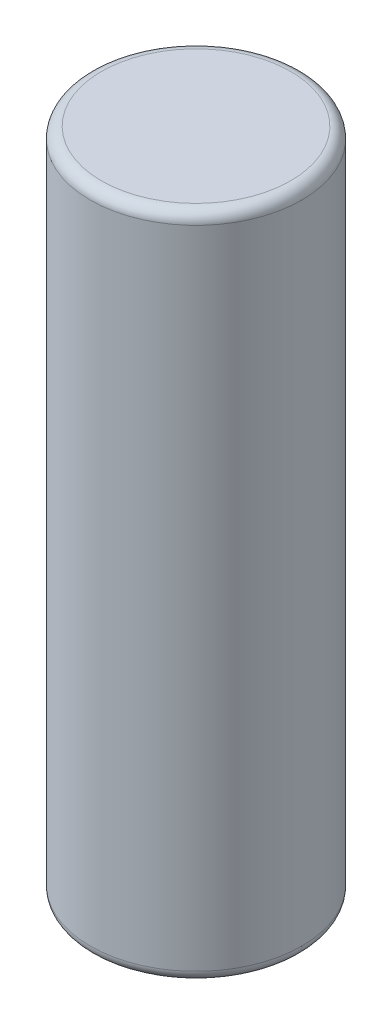
ISO-10303-21;
HEADER;
FILE_DESCRIPTION(('STEP AP214'),'2;1');
FILE_NAME('part.step','',(''),(''),'','','');
FILE_SCHEMA(('AUTOMOTIVE_DESIGN { 1 0 10303 214 1 1 1 1 }'));
ENDSEC;
DATA;
#1=APPLICATION_CONTEXT('core data for automotive mechanical design processes');
#2=APPLICATION_PROTOCOL_DEFINITION('international standard','automotive_design',2000,#1);
#3=PRODUCT_CONTEXT('',#1,'mechanical');
#4=PRODUCT('Part','Part','',(#3));
#5=PRODUCT_RELATED_PRODUCT_CATEGORY('part','',(#4));
#6=PRODUCT_DEFINITION_FORMATION('','',#4);
#7=PRODUCT_DEFINITION_CONTEXT('part definition',#1,'design');
#8=PRODUCT_DEFINITION('design','',#6,#7);
#9=PRODUCT_DEFINITION_SHAPE('','',#8);
#10=(LENGTH_UNIT() NAMED_UNIT(*) SI_UNIT(.MILLI.,.METRE.));
#11=(NAMED_UNIT(*) PLANE_ANGLE_UNIT() SI_UNIT($,.RADIAN.));
#12=(NAMED_UNIT(*) SI_UNIT($,.STERADIAN.) SOLID_ANGLE_UNIT());
#13=UNCERTAINTY_MEASURE_WITH_UNIT(LENGTH_MEASURE(1.E-05),#10,'distance_accuracy_value','');
#14=(GEOMETRIC_REPRESENTATION_CONTEXT(3) GLOBAL_UNCERTAINTY_ASSIGNED_CONTEXT((#13)) GLOBAL_UNIT_ASSIGNED_CONTEXT((#10,
#11,#12)) REPRESENTATION_CONTEXT('',''));
#15=CARTESIAN_POINT('',(0.,0.,0.));
#16=DIRECTION('',(0.,0.,1.));
#17=DIRECTION('',(1.,0.,0.));
#18=AXIS2_PLACEMENT_3D('',#15,#16,#17);
#19=CARTESIAN_POINT('',(0.,60.,0.));
#20=DIRECTION('',(0.,-1.,0.));
#21=DIRECTION('',(0.,0.,-1.));
#22=AXIS2_PLACEMENT_3D('',#19,#20,#21);
#23=CYLINDRICAL_SURFACE('',#22,9.5);
#24=CARTESIAN_POINT('',(0.,1.,0.));
#25=DIRECTION('',(0.,1.,0.));
#26=DIRECTION('',(0.,0.,1.));
#27=AXIS2_PLACEMENT_3D('',#24,#25,#26);
#28=CIRCLE('',#27,9.5);
#29=CARTESIAN_POINT('',(0.,1.,9.5));
#30=VERTEX_POINT('',#29);
#31=EDGE_CURVE('E50',#30,#30,#28,.T.);
#32=ORIENTED_EDGE('',*,*,#31,.T.);
#33=EDGE_LOOP('',(#32));
#34=FACE_BOUND('',#33,.T.);
#35=CARTESIAN_POINT('',(0.,59.,0.));
#36=DIRECTION('',(0.,1.,0.));
#37=DIRECTION('',(0.,0.,1.));
#38=AXIS2_PLACEMENT_3D('',#35,#36,#37);
#39=CIRCLE('',#38,9.5);
#40=CARTESIAN_POINT('',(0.,59.,9.5));
#41=VERTEX_POINT('',#40);
#42=EDGE_CURVE('E54',#41,#41,#39,.F.);
#43=ORIENTED_EDGE('',*,*,#42,.T.);
#44=EDGE_LOOP('',(#43));
#45=FACE_BOUND('',#44,.T.);
#46=ADVANCED_FACE('F39',(#34,#45),#23,.T.);
#47=CARTESIAN_POINT('',(0.,60.,0.));
#48=DIRECTION('',(0.,1.,0.));
#49=DIRECTION('',(0.,0.,1.));
#50=AXIS2_PLACEMENT_3D('',#47,#48,#49);
#51=PLANE('',#50);
#52=CARTESIAN_POINT('',(0.,60.,0.));
#53=DIRECTION('',(0.,1.,0.));
#54=DIRECTION('',(0.,0.,1.));
#55=AXIS2_PLACEMENT_3D('',#52,#53,#54);
#56=CIRCLE('',#55,8.5);
#57=CARTESIAN_POINT('',(0.,60.,8.5));
#58=VERTEX_POINT('',#57);
#59=EDGE_CURVE('E10',#58,#58,#56,.T.);
#60=ORIENTED_EDGE('',*,*,#59,.T.);
#61=EDGE_LOOP('',(#60));
#62=FACE_BOUND('',#61,.T.);
#63=ADVANCED_FACE('F70',(#62),#51,.T.);
#64=CARTESIAN_POINT('',(0.,0.,0.));
#65=DIRECTION('',(0.,1.,0.));
#66=DIRECTION('',(0.,0.,1.));
#67=AXIS2_PLACEMENT_3D('',#64,#65,#66);
#68=PLANE('',#67);
#69=CARTESIAN_POINT('',(0.,0.,0.));
#70=DIRECTION('',(0.,1.,0.));
#71=DIRECTION('',(0.,0.,1.));
#72=AXIS2_PLACEMENT_3D('',#69,#70,#71);
#73=CIRCLE('',#72,8.5);
#74=CARTESIAN_POINT('',(0.,0.,8.5));
#75=VERTEX_POINT('',#74);
#76=EDGE_CURVE('E46',#75,#75,#73,.F.);
#77=ORIENTED_EDGE('',*,*,#76,.T.);
#78=EDGE_LOOP('',(#77));
#79=FACE_BOUND('',#78,.T.);
#80=ADVANCED_FACE('F67',(#79),#68,.F.);
#81=CARTESIAN_POINT('',(0.,1.,0.));
#82=DIRECTION('',(0.,1.,0.));
#83=DIRECTION('',(0.,0.,1.));
#84=AXIS2_PLACEMENT_3D('',#81,#82,#83);
#85=TOROIDAL_SURFACE('',#84,8.5,1.);
#86=ORIENTED_EDGE('',*,*,#76,.F.);
#87=EDGE_LOOP('',(#86));
#88=FACE_BOUND('',#87,.T.);
#89=ORIENTED_EDGE('',*,*,#31,.F.);
#90=EDGE_LOOP('',(#89));
#91=FACE_BOUND('',#90,.T.);
#92=ADVANCED_FACE('F63',(#88,#91),#85,.T.);
#93=CARTESIAN_POINT('',(0.,59.,0.));
#94=DIRECTION('',(0.,1.,0.));
#95=DIRECTION('',(0.,0.,1.));
#96=AXIS2_PLACEMENT_3D('',#93,#94,#95);
#97=TOROIDAL_SURFACE('',#96,8.5,1.);
#98=ORIENTED_EDGE('',*,*,#42,.F.);
#99=EDGE_LOOP('',(#98));
#100=FACE_BOUND('',#99,.T.);
#101=ORIENTED_EDGE('',*,*,#59,.F.);
#102=EDGE_LOOP('',(#101));
#103=FACE_BOUND('',#102,.T.);
#104=ADVANCED_FACE('F41',(#100,#103),#97,.T.);
#105=CLOSED_SHELL('',(#46,#63,#80,#92,#104));
#106=MANIFOLD_SOLID_BREP('B2',#105);
#107=ADVANCED_BREP_SHAPE_REPRESENTATION('',(#18,#106),#14);
#108=SHAPE_DEFINITION_REPRESENTATION(#9,#107);
ENDSEC;
END-ISO-10303-21;
